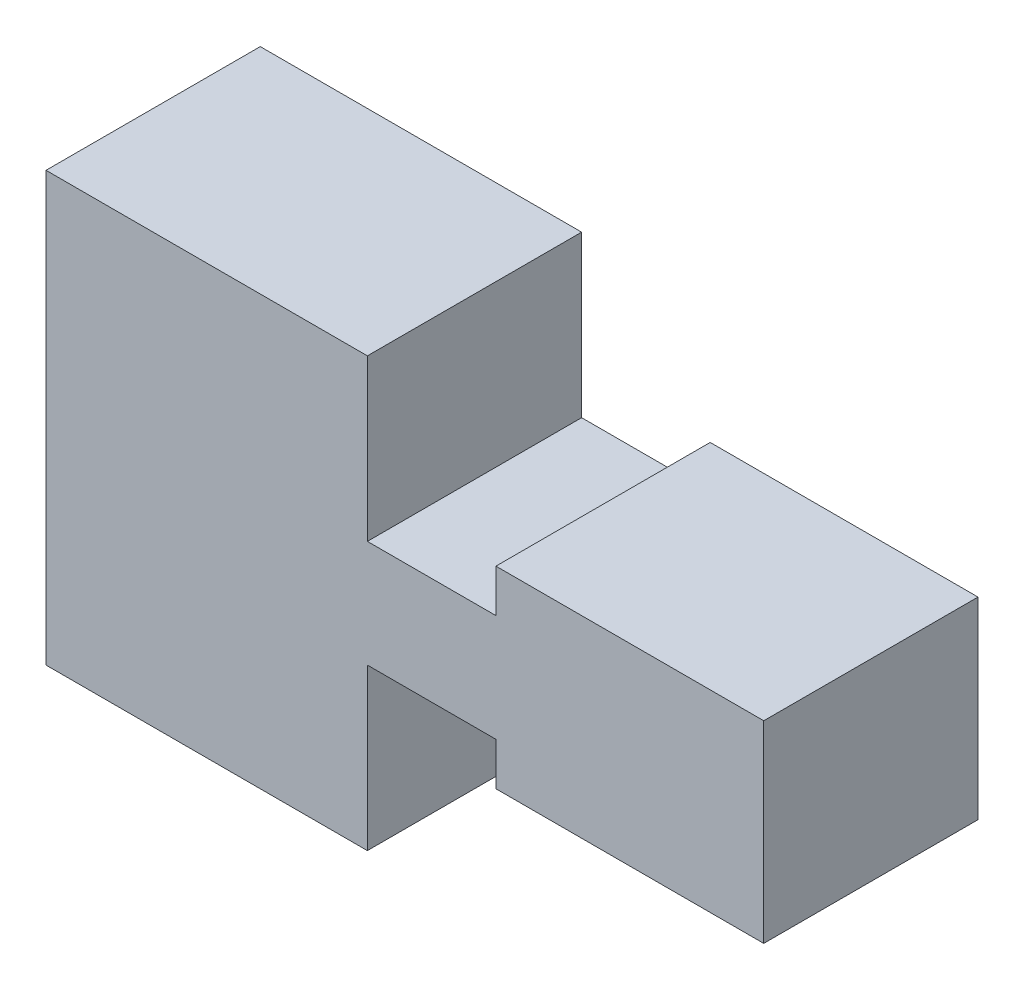
ISO-10303-21;
HEADER;
FILE_DESCRIPTION(('STEP AP214'),'2;1');
FILE_NAME('part.step','',(''),(''),'','','');
FILE_SCHEMA(('AUTOMOTIVE_DESIGN { 1 0 10303 214 1 1 1 1 }'));
ENDSEC;
DATA;
#1=APPLICATION_CONTEXT('core data for automotive mechanical design processes');
#2=APPLICATION_PROTOCOL_DEFINITION('international standard','automotive_design',2000,#1);
#3=PRODUCT_CONTEXT('',#1,'mechanical');
#4=PRODUCT('Part','Part','',(#3));
#5=PRODUCT_RELATED_PRODUCT_CATEGORY('part','',(#4));
#6=PRODUCT_DEFINITION_FORMATION('','',#4);
#7=PRODUCT_DEFINITION_CONTEXT('part definition',#1,'design');
#8=PRODUCT_DEFINITION('design','',#6,#7);
#9=PRODUCT_DEFINITION_SHAPE('','',#8);
#10=(LENGTH_UNIT() NAMED_UNIT(*) SI_UNIT(.MILLI.,.METRE.));
#11=(NAMED_UNIT(*) PLANE_ANGLE_UNIT() SI_UNIT($,.RADIAN.));
#12=(NAMED_UNIT(*) SI_UNIT($,.STERADIAN.) SOLID_ANGLE_UNIT());
#13=UNCERTAINTY_MEASURE_WITH_UNIT(LENGTH_MEASURE(1.E-05),#10,'distance_accuracy_value','');
#14=(GEOMETRIC_REPRESENTATION_CONTEXT(3) GLOBAL_UNCERTAINTY_ASSIGNED_CONTEXT((#13)) GLOBAL_UNIT_ASSIGNED_CONTEXT((#10,
#11,#12)) REPRESENTATION_CONTEXT('',''));
#15=CARTESIAN_POINT('',(0.,0.,0.));
#16=DIRECTION('',(0.,0.,1.));
#17=DIRECTION('',(1.,0.,0.));
#18=AXIS2_PLACEMENT_3D('',#15,#16,#17);
#19=CARTESIAN_POINT('',(0.,-10.,10.));
#20=DIRECTION('',(0.,1.,0.));
#21=DIRECTION('',(0.,0.,1.));
#22=AXIS2_PLACEMENT_3D('',#19,#20,#21);
#23=PLANE('',#22);
#24=DIRECTION('',(1.,0.,0.));
#25=VECTOR('',#24,1.);
#26=CARTESIAN_POINT('',(0.,-10.,0.));
#27=LINE('',#26,#25);
#28=CARTESIAN_POINT('',(-7.5,-10.,0.));
#29=VERTEX_POINT('',#28);
#30=CARTESIAN_POINT('',(7.5,-10.,0.));
#31=VERTEX_POINT('',#30);
#32=EDGE_CURVE('E163',#29,#31,#27,.T.);
#33=ORIENTED_EDGE('',*,*,#32,.T.);
#34=DIRECTION('',(0.,0.,-1.));
#35=VECTOR('',#34,1.);
#36=CARTESIAN_POINT('',(7.5,-10.,10.));
#37=LINE('',#36,#35);
#38=CARTESIAN_POINT('',(7.5,-10.,10.));
#39=VERTEX_POINT('',#38);
#40=EDGE_CURVE('E11',#39,#31,#37,.T.);
#41=ORIENTED_EDGE('',*,*,#40,.F.);
#42=DIRECTION('',(1.,0.,0.));
#43=VECTOR('',#42,1.);
#44=CARTESIAN_POINT('',(0.,-10.,10.));
#45=LINE('',#44,#43);
#46=CARTESIAN_POINT('',(-7.5,-10.,10.));
#47=VERTEX_POINT('',#46);
#48=EDGE_CURVE('E190',#47,#39,#45,.T.);
#49=ORIENTED_EDGE('',*,*,#48,.F.);
#50=DIRECTION('',(0.,0.,-1.));
#51=VECTOR('',#50,1.);
#52=CARTESIAN_POINT('',(-7.5,-10.,10.));
#53=LINE('',#52,#51);
#54=EDGE_CURVE('E57',#47,#29,#53,.T.);
#55=ORIENTED_EDGE('',*,*,#54,.T.);
#56=EDGE_LOOP('',(#33,#41,#49,#55));
#57=FACE_BOUND('',#56,.T.);
#58=ADVANCED_FACE('F41',(#57),#23,.F.);
#59=CARTESIAN_POINT('',(7.5,0.,10.));
#60=DIRECTION('',(-1.,0.,0.));
#61=DIRECTION('',(0.,0.,1.));
#62=AXIS2_PLACEMENT_3D('',#59,#60,#61);
#63=PLANE('',#62);
#64=DIRECTION('',(0.,1.,0.));
#65=VECTOR('',#64,1.);
#66=CARTESIAN_POINT('',(7.5,0.,0.));
#67=LINE('',#66,#65);
#68=CARTESIAN_POINT('',(7.5,-2.5,0.));
#69=VERTEX_POINT('',#68);
#70=EDGE_CURVE('E165',#31,#69,#67,.T.);
#71=ORIENTED_EDGE('',*,*,#70,.T.);
#72=DIRECTION('',(0.,0.,-1.));
#73=VECTOR('',#72,1.);
#74=CARTESIAN_POINT('',(7.5,-2.5,10.));
#75=LINE('',#74,#73);
#76=CARTESIAN_POINT('',(7.5,-2.5,10.));
#77=VERTEX_POINT('',#76);
#78=EDGE_CURVE('E49',#77,#69,#75,.T.);
#79=ORIENTED_EDGE('',*,*,#78,.F.);
#80=DIRECTION('',(0.,1.,0.));
#81=VECTOR('',#80,1.);
#82=CARTESIAN_POINT('',(7.5,0.,10.));
#83=LINE('',#82,#81);
#84=EDGE_CURVE('E107',#39,#77,#83,.T.);
#85=ORIENTED_EDGE('',*,*,#84,.F.);
#86=ORIENTED_EDGE('',*,*,#40,.T.);
#87=EDGE_LOOP('',(#71,#79,#85,#86));
#88=FACE_BOUND('',#87,.T.);
#89=ADVANCED_FACE('F261',(#88),#63,.F.);
#90=CARTESIAN_POINT('',(0.,-2.5,10.));
#91=DIRECTION('',(0.,1.,0.));
#92=DIRECTION('',(-1.,0.,0.));
#93=AXIS2_PLACEMENT_3D('',#90,#91,#92);
#94=PLANE('',#93);
#95=DIRECTION('',(1.,0.,0.));
#96=VECTOR('',#95,1.);
#97=CARTESIAN_POINT('',(0.,-2.5,0.));
#98=LINE('',#97,#96);
#99=CARTESIAN_POINT('',(13.5,-2.5,0.));
#100=VERTEX_POINT('',#99);
#101=EDGE_CURVE('E167',#69,#100,#98,.T.);
#102=ORIENTED_EDGE('',*,*,#101,.T.);
#103=DIRECTION('',(0.,0.,-1.));
#104=VECTOR('',#103,1.);
#105=CARTESIAN_POINT('',(13.5,-2.5,10.));
#106=LINE('',#105,#104);
#107=CARTESIAN_POINT('',(13.5,-2.5,10.));
#108=VERTEX_POINT('',#107);
#109=EDGE_CURVE('E205',#108,#100,#106,.T.);
#110=ORIENTED_EDGE('',*,*,#109,.F.);
#111=DIRECTION('',(1.,0.,0.));
#112=VECTOR('',#111,1.);
#113=CARTESIAN_POINT('',(0.,-2.5,10.));
#114=LINE('',#113,#112);
#115=EDGE_CURVE('E212',#77,#108,#114,.T.);
#116=ORIENTED_EDGE('',*,*,#115,.F.);
#117=ORIENTED_EDGE('',*,*,#78,.T.);
#118=EDGE_LOOP('',(#102,#110,#116,#117));
#119=FACE_BOUND('',#118,.T.);
#120=ADVANCED_FACE('F210',(#119),#94,.F.);
#121=CARTESIAN_POINT('',(13.5,0.,10.));
#122=DIRECTION('',(-1.,0.,0.));
#123=DIRECTION('',(0.,0.,1.));
#124=AXIS2_PLACEMENT_3D('',#121,#122,#123);
#125=PLANE('',#124);
#126=DIRECTION('',(0.,1.,0.));
#127=VECTOR('',#126,1.);
#128=CARTESIAN_POINT('',(13.5,0.,0.));
#129=LINE('',#128,#127);
#130=CARTESIAN_POINT('',(13.5,-4.5,0.));
#131=VERTEX_POINT('',#130);
#132=EDGE_CURVE('E170',#131,#100,#129,.T.);
#133=ORIENTED_EDGE('',*,*,#132,.F.);
#134=DIRECTION('',(0.,0.,-1.));
#135=VECTOR('',#134,1.);
#136=CARTESIAN_POINT('',(13.5,-4.5,10.));
#137=LINE('',#136,#135);
#138=CARTESIAN_POINT('',(13.5,-4.5,10.));
#139=VERTEX_POINT('',#138);
#140=EDGE_CURVE('E203',#139,#131,#137,.T.);
#141=ORIENTED_EDGE('',*,*,#140,.F.);
#142=DIRECTION('',(0.,1.,0.));
#143=VECTOR('',#142,1.);
#144=CARTESIAN_POINT('',(13.5,0.,10.));
#145=LINE('',#144,#143);
#146=EDGE_CURVE('E223',#139,#108,#145,.T.);
#147=ORIENTED_EDGE('',*,*,#146,.T.);
#148=ORIENTED_EDGE('',*,*,#109,.T.);
#149=EDGE_LOOP('',(#133,#141,#147,#148));
#150=FACE_BOUND('',#149,.T.);
#151=ADVANCED_FACE('F219',(#150),#125,.T.);
#152=CARTESIAN_POINT('',(0.,-4.5,10.));
#153=DIRECTION('',(0.,1.,0.));
#154=DIRECTION('',(0.,0.,1.));
#155=AXIS2_PLACEMENT_3D('',#152,#153,#154);
#156=PLANE('',#155);
#157=DIRECTION('',(1.,0.,0.));
#158=VECTOR('',#157,1.);
#159=CARTESIAN_POINT('',(0.,-4.5,0.));
#160=LINE('',#159,#158);
#161=CARTESIAN_POINT('',(26.,-4.5,0.));
#162=VERTEX_POINT('',#161);
#163=EDGE_CURVE('E173',#131,#162,#160,.T.);
#164=ORIENTED_EDGE('',*,*,#163,.T.);
#165=DIRECTION('',(0.,0.,-1.));
#166=VECTOR('',#165,1.);
#167=CARTESIAN_POINT('',(26.,-4.5,10.));
#168=LINE('',#167,#166);
#169=CARTESIAN_POINT('',(26.,-4.5,10.));
#170=VERTEX_POINT('',#169);
#171=EDGE_CURVE('E200',#170,#162,#168,.T.);
#172=ORIENTED_EDGE('',*,*,#171,.F.);
#173=DIRECTION('',(1.,0.,0.));
#174=VECTOR('',#173,1.);
#175=CARTESIAN_POINT('',(0.,-4.5,10.));
#176=LINE('',#175,#174);
#177=EDGE_CURVE('E224',#139,#170,#176,.T.);
#178=ORIENTED_EDGE('',*,*,#177,.F.);
#179=ORIENTED_EDGE('',*,*,#140,.T.);
#180=EDGE_LOOP('',(#164,#172,#178,#179));
#181=FACE_BOUND('',#180,.T.);
#182=ADVANCED_FACE('F285',(#181),#156,.F.);
#183=CARTESIAN_POINT('',(26.,0.,10.));
#184=DIRECTION('',(-1.,0.,0.));
#185=DIRECTION('',(0.,0.,1.));
#186=AXIS2_PLACEMENT_3D('',#183,#184,#185);
#187=PLANE('',#186);
#188=DIRECTION('',(0.,1.,0.));
#189=VECTOR('',#188,1.);
#190=CARTESIAN_POINT('',(26.,0.,0.));
#191=LINE('',#190,#189);
#192=CARTESIAN_POINT('',(26.,4.5,0.));
#193=VERTEX_POINT('',#192);
#194=EDGE_CURVE('E176',#162,#193,#191,.T.);
#195=ORIENTED_EDGE('',*,*,#194,.T.);
#196=DIRECTION('',(0.,0.,-1.));
#197=VECTOR('',#196,1.);
#198=CARTESIAN_POINT('',(26.,4.5,10.));
#199=LINE('',#198,#197);
#200=CARTESIAN_POINT('',(26.,4.5,10.));
#201=VERTEX_POINT('',#200);
#202=EDGE_CURVE('E198',#201,#193,#199,.T.);
#203=ORIENTED_EDGE('',*,*,#202,.F.);
#204=DIRECTION('',(0.,1.,0.));
#205=VECTOR('',#204,1.);
#206=CARTESIAN_POINT('',(26.,0.,10.));
#207=LINE('',#206,#205);
#208=EDGE_CURVE('E227',#170,#201,#207,.T.);
#209=ORIENTED_EDGE('',*,*,#208,.F.);
#210=ORIENTED_EDGE('',*,*,#171,.T.);
#211=EDGE_LOOP('',(#195,#203,#209,#210));
#212=FACE_BOUND('',#211,.T.);
#213=ADVANCED_FACE('F241',(#212),#187,.F.);
#214=CARTESIAN_POINT('',(0.,4.5,10.));
#215=DIRECTION('',(0.,1.,0.));
#216=DIRECTION('',(0.,0.,1.));
#217=AXIS2_PLACEMENT_3D('',#214,#215,#216);
#218=PLANE('',#217);
#219=DIRECTION('',(1.,0.,0.));
#220=VECTOR('',#219,1.);
#221=CARTESIAN_POINT('',(0.,4.5,0.));
#222=LINE('',#221,#220);
#223=CARTESIAN_POINT('',(13.5,4.5,0.));
#224=VERTEX_POINT('',#223);
#225=EDGE_CURVE('E179',#224,#193,#222,.T.);
#226=ORIENTED_EDGE('',*,*,#225,.F.);
#227=DIRECTION('',(0.,0.,-1.));
#228=VECTOR('',#227,1.);
#229=CARTESIAN_POINT('',(13.5,4.5,10.));
#230=LINE('',#229,#228);
#231=CARTESIAN_POINT('',(13.5,4.5,10.));
#232=VERTEX_POINT('',#231);
#233=EDGE_CURVE('E196',#232,#224,#230,.T.);
#234=ORIENTED_EDGE('',*,*,#233,.F.);
#235=DIRECTION('',(1.,0.,0.));
#236=VECTOR('',#235,1.);
#237=CARTESIAN_POINT('',(0.,4.5,10.));
#238=LINE('',#237,#236);
#239=EDGE_CURVE('E231',#232,#201,#238,.T.);
#240=ORIENTED_EDGE('',*,*,#239,.T.);
#241=ORIENTED_EDGE('',*,*,#202,.T.);
#242=EDGE_LOOP('',(#226,#234,#240,#241));
#243=FACE_BOUND('',#242,.T.);
#244=ADVANCED_FACE('F243',(#243),#218,.T.);
#245=CARTESIAN_POINT('',(13.5,2.5,0.));
#246=VERTEX_POINT('',#245);
#247=EDGE_CURVE('E174',#246,#224,#129,.T.);
#248=ORIENTED_EDGE('',*,*,#247,.F.);
#249=DIRECTION('',(0.,0.,-1.));
#250=VECTOR('',#249,1.);
#251=CARTESIAN_POINT('',(13.5,2.5,10.));
#252=LINE('',#251,#250);
#253=CARTESIAN_POINT('',(13.5,2.5,10.));
#254=VERTEX_POINT('',#253);
#255=EDGE_CURVE('E194',#254,#246,#252,.T.);
#256=ORIENTED_EDGE('',*,*,#255,.F.);
#257=EDGE_CURVE('E226',#254,#232,#145,.T.);
#258=ORIENTED_EDGE('',*,*,#257,.T.);
#259=ORIENTED_EDGE('',*,*,#233,.T.);
#260=EDGE_LOOP('',(#248,#256,#258,#259));
#261=FACE_BOUND('',#260,.T.);
#262=ADVANCED_FACE('F247',(#261),#125,.T.);
#263=CARTESIAN_POINT('',(0.,2.5,10.));
#264=DIRECTION('',(0.,1.,0.));
#265=DIRECTION('',(-1.,0.,0.));
#266=AXIS2_PLACEMENT_3D('',#263,#264,#265);
#267=PLANE('',#266);
#268=DIRECTION('',(1.,0.,0.));
#269=VECTOR('',#268,1.);
#270=CARTESIAN_POINT('',(0.,2.5,0.));
#271=LINE('',#270,#269);
#272=CARTESIAN_POINT('',(7.5,2.5,0.));
#273=VERTEX_POINT('',#272);
#274=EDGE_CURVE('E182',#273,#246,#271,.T.);
#275=ORIENTED_EDGE('',*,*,#274,.F.);
#276=DIRECTION('',(0.,0.,-1.));
#277=VECTOR('',#276,1.);
#278=CARTESIAN_POINT('',(7.5,2.5,10.));
#279=LINE('',#278,#277);
#280=CARTESIAN_POINT('',(7.5,2.5,10.));
#281=VERTEX_POINT('',#280);
#282=EDGE_CURVE('E154',#281,#273,#279,.T.);
#283=ORIENTED_EDGE('',*,*,#282,.F.);
#284=DIRECTION('',(1.,0.,0.));
#285=VECTOR('',#284,1.);
#286=CARTESIAN_POINT('',(0.,2.5,10.));
#287=LINE('',#286,#285);
#288=EDGE_CURVE('E144',#281,#254,#287,.T.);
#289=ORIENTED_EDGE('',*,*,#288,.T.);
#290=ORIENTED_EDGE('',*,*,#255,.T.);
#291=EDGE_LOOP('',(#275,#283,#289,#290));
#292=FACE_BOUND('',#291,.T.);
#293=ADVANCED_FACE('F249',(#292),#267,.T.);
#294=CARTESIAN_POINT('',(7.5,10.,0.));
#295=VERTEX_POINT('',#294);
#296=EDGE_CURVE('E151',#273,#295,#67,.T.);
#297=ORIENTED_EDGE('',*,*,#296,.T.);
#298=DIRECTION('',(0.,0.,-1.));
#299=VECTOR('',#298,1.);
#300=CARTESIAN_POINT('',(7.5,10.,10.));
#301=LINE('',#300,#299);
#302=CARTESIAN_POINT('',(7.5,10.,10.));
#303=VERTEX_POINT('',#302);
#304=EDGE_CURVE('E148',#303,#295,#301,.T.);
#305=ORIENTED_EDGE('',*,*,#304,.F.);
#306=EDGE_CURVE('E136',#281,#303,#83,.T.);
#307=ORIENTED_EDGE('',*,*,#306,.F.);
#308=ORIENTED_EDGE('',*,*,#282,.T.);
#309=EDGE_LOOP('',(#297,#305,#307,#308));
#310=FACE_BOUND('',#309,.T.);
#311=ADVANCED_FACE('F149',(#310),#63,.F.);
#312=CARTESIAN_POINT('',(0.,10.,10.));
#313=DIRECTION('',(0.,1.,0.));
#314=DIRECTION('',(0.,0.,1.));
#315=AXIS2_PLACEMENT_3D('',#312,#313,#314);
#316=PLANE('',#315);
#317=DIRECTION('',(1.,0.,0.));
#318=VECTOR('',#317,1.);
#319=CARTESIAN_POINT('',(0.,10.,0.));
#320=LINE('',#319,#318);
#321=CARTESIAN_POINT('',(-7.5,10.,0.));
#322=VERTEX_POINT('',#321);
#323=EDGE_CURVE('E185',#322,#295,#320,.T.);
#324=ORIENTED_EDGE('',*,*,#323,.F.);
#325=DIRECTION('',(0.,0.,-1.));
#326=VECTOR('',#325,1.);
#327=CARTESIAN_POINT('',(-7.5,10.,10.));
#328=LINE('',#327,#326);
#329=CARTESIAN_POINT('',(-7.5,10.,10.));
#330=VERTEX_POINT('',#329);
#331=EDGE_CURVE('E95',#330,#322,#328,.T.);
#332=ORIENTED_EDGE('',*,*,#331,.F.);
#333=DIRECTION('',(1.,0.,0.));
#334=VECTOR('',#333,1.);
#335=CARTESIAN_POINT('',(0.,10.,10.));
#336=LINE('',#335,#334);
#337=EDGE_CURVE('E141',#330,#303,#336,.T.);
#338=ORIENTED_EDGE('',*,*,#337,.T.);
#339=ORIENTED_EDGE('',*,*,#304,.T.);
#340=EDGE_LOOP('',(#324,#332,#338,#339));
#341=FACE_BOUND('',#340,.T.);
#342=ADVANCED_FACE('F156',(#341),#316,.T.);
#343=CARTESIAN_POINT('',(-7.5,0.,10.));
#344=DIRECTION('',(-1.,0.,0.));
#345=DIRECTION('',(0.,0.,1.));
#346=AXIS2_PLACEMENT_3D('',#343,#344,#345);
#347=PLANE('',#346);
#348=DIRECTION('',(0.,1.,0.));
#349=VECTOR('',#348,1.);
#350=CARTESIAN_POINT('',(-7.5,0.,0.));
#351=LINE('',#350,#349);
#352=EDGE_CURVE('E187',#29,#322,#351,.T.);
#353=ORIENTED_EDGE('',*,*,#352,.F.);
#354=ORIENTED_EDGE('',*,*,#54,.F.);
#355=DIRECTION('',(0.,1.,0.));
#356=VECTOR('',#355,1.);
#357=CARTESIAN_POINT('',(-7.5,0.,10.));
#358=LINE('',#357,#356);
#359=EDGE_CURVE('E157',#47,#330,#358,.T.);
#360=ORIENTED_EDGE('',*,*,#359,.T.);
#361=ORIENTED_EDGE('',*,*,#331,.T.);
#362=EDGE_LOOP('',(#353,#354,#360,#361));
#363=FACE_BOUND('',#362,.T.);
#364=ADVANCED_FACE('F250',(#363),#347,.T.);
#365=CARTESIAN_POINT('',(0.,0.,10.));
#366=DIRECTION('',(0.,0.,1.));
#367=DIRECTION('',(1.,0.,0.));
#368=AXIS2_PLACEMENT_3D('',#365,#366,#367);
#369=PLANE('',#368);
#370=ORIENTED_EDGE('',*,*,#48,.T.);
#371=ORIENTED_EDGE('',*,*,#84,.T.);
#372=ORIENTED_EDGE('',*,*,#115,.T.);
#373=ORIENTED_EDGE('',*,*,#146,.F.);
#374=ORIENTED_EDGE('',*,*,#177,.T.);
#375=ORIENTED_EDGE('',*,*,#208,.T.);
#376=ORIENTED_EDGE('',*,*,#239,.F.);
#377=ORIENTED_EDGE('',*,*,#257,.F.);
#378=ORIENTED_EDGE('',*,*,#288,.F.);
#379=ORIENTED_EDGE('',*,*,#306,.T.);
#380=ORIENTED_EDGE('',*,*,#337,.F.);
#381=ORIENTED_EDGE('',*,*,#359,.F.);
#382=EDGE_LOOP('',(#370,#371,#372,#373,#374,#375,#376,#377,#378,#379,#380,#381));
#383=FACE_BOUND('',#382,.T.);
#384=ADVANCED_FACE('F138',(#383),#369,.T.);
#385=CARTESIAN_POINT('',(0.,0.,0.));
#386=DIRECTION('',(0.,0.,1.));
#387=DIRECTION('',(1.,0.,0.));
#388=AXIS2_PLACEMENT_3D('',#385,#386,#387);
#389=PLANE('',#388);
#390=ORIENTED_EDGE('',*,*,#32,.F.);
#391=ORIENTED_EDGE('',*,*,#352,.T.);
#392=ORIENTED_EDGE('',*,*,#323,.T.);
#393=ORIENTED_EDGE('',*,*,#296,.F.);
#394=ORIENTED_EDGE('',*,*,#274,.T.);
#395=ORIENTED_EDGE('',*,*,#247,.T.);
#396=ORIENTED_EDGE('',*,*,#225,.T.);
#397=ORIENTED_EDGE('',*,*,#194,.F.);
#398=ORIENTED_EDGE('',*,*,#163,.F.);
#399=ORIENTED_EDGE('',*,*,#132,.T.);
#400=ORIENTED_EDGE('',*,*,#101,.F.);
#401=ORIENTED_EDGE('',*,*,#70,.F.);
#402=EDGE_LOOP('',(#390,#391,#392,#393,#394,#395,#396,#397,#398,#399,#400,#401));
#403=FACE_BOUND('',#402,.T.);
#404=ADVANCED_FACE('F214',(#403),#389,.F.);
#405=CLOSED_SHELL('',(#58,#89,#120,#151,#182,#213,#244,#262,#293,#311,#342,#364,#384,#404));
#406=MANIFOLD_SOLID_BREP('B2',#405);
#407=ADVANCED_BREP_SHAPE_REPRESENTATION('',(#18,#406),#14);
#408=SHAPE_DEFINITION_REPRESENTATION(#9,#407);
ENDSEC;
END-ISO-10303-21;
